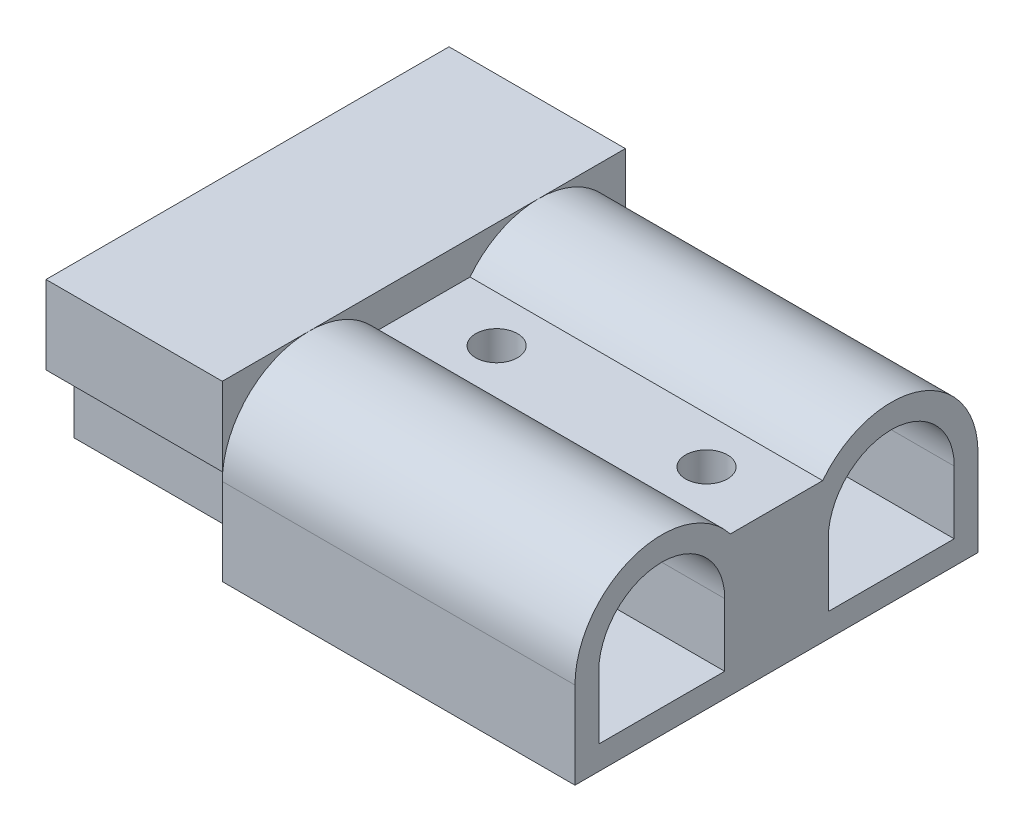
ISO-10303-21;
HEADER;
FILE_DESCRIPTION(('STEP AP214'),'2;1');
FILE_NAME('part.step','',(''),(''),'','','');
FILE_SCHEMA(('AUTOMOTIVE_DESIGN { 1 0 10303 214 1 1 1 1 }'));
ENDSEC;
DATA;
#1=APPLICATION_CONTEXT('core data for automotive mechanical design processes');
#2=APPLICATION_PROTOCOL_DEFINITION('international standard','automotive_design',2000,#1);
#3=PRODUCT_CONTEXT('',#1,'mechanical');
#4=PRODUCT('Part','Part','',(#3));
#5=PRODUCT_RELATED_PRODUCT_CATEGORY('part','',(#4));
#6=PRODUCT_DEFINITION_FORMATION('','',#4);
#7=PRODUCT_DEFINITION_CONTEXT('part definition',#1,'design');
#8=PRODUCT_DEFINITION('design','',#6,#7);
#9=PRODUCT_DEFINITION_SHAPE('','',#8);
#10=(LENGTH_UNIT() NAMED_UNIT(*) SI_UNIT(.MILLI.,.METRE.));
#11=(NAMED_UNIT(*) PLANE_ANGLE_UNIT() SI_UNIT($,.RADIAN.));
#12=(NAMED_UNIT(*) SI_UNIT($,.STERADIAN.) SOLID_ANGLE_UNIT());
#13=UNCERTAINTY_MEASURE_WITH_UNIT(LENGTH_MEASURE(1.E-05),#10,'distance_accuracy_value','');
#14=(GEOMETRIC_REPRESENTATION_CONTEXT(3) GLOBAL_UNCERTAINTY_ASSIGNED_CONTEXT((#13)) GLOBAL_UNIT_ASSIGNED_CONTEXT((#10,
#11,#12)) REPRESENTATION_CONTEXT('',''));
#15=CARTESIAN_POINT('',(0.,0.,0.));
#16=DIRECTION('',(0.,0.,1.));
#17=DIRECTION('',(1.,0.,0.));
#18=AXIS2_PLACEMENT_3D('',#15,#16,#17);
#19=CARTESIAN_POINT('',(0.,-5.842,-18.288));
#20=DIRECTION('',(0.,-1.,0.));
#21=DIRECTION('',(0.,0.,-1.));
#22=AXIS2_PLACEMENT_3D('',#19,#20,#21);
#23=PLANE('',#22);
#24=DIRECTION('',(1.,0.,0.));
#25=VECTOR('',#24,1.);
#26=CARTESIAN_POINT('',(-16.002,-5.842,-1.27));
#27=LINE('',#26,#25);
#28=CARTESIAN_POINT('',(-16.002,-5.842,-1.27));
#29=VERTEX_POINT('',#28);
#30=CARTESIAN_POINT('',(0.,-5.842,-1.27));
#31=VERTEX_POINT('',#30);
#32=EDGE_CURVE('E50',#29,#31,#27,.T.);
#33=ORIENTED_EDGE('',*,*,#32,.F.);
#34=DIRECTION('',(0.,0.,-1.));
#35=VECTOR('',#34,1.);
#36=CARTESIAN_POINT('',(-16.002,-5.842,-18.288));
#37=LINE('',#36,#35);
#38=CARTESIAN_POINT('',(-16.002,-5.842,-15.748));
#39=VERTEX_POINT('',#38);
#40=EDGE_CURVE('E315',#29,#39,#37,.T.);
#41=ORIENTED_EDGE('',*,*,#40,.T.);
#42=DIRECTION('',(-1.,0.,0.));
#43=VECTOR('',#42,1.);
#44=CARTESIAN_POINT('',(0.,-5.842,-15.748));
#45=LINE('',#44,#43);
#46=CARTESIAN_POINT('',(0.,-5.842,-15.748));
#47=VERTEX_POINT('',#46);
#48=EDGE_CURVE('E289',#47,#39,#45,.T.);
#49=ORIENTED_EDGE('',*,*,#48,.F.);
#50=DIRECTION('',(0.,0.,-1.));
#51=VECTOR('',#50,1.);
#52=CARTESIAN_POINT('',(0.,-5.842,-18.288));
#53=LINE('',#52,#51);
#54=EDGE_CURVE('E38',#31,#47,#53,.T.);
#55=ORIENTED_EDGE('',*,*,#54,.F.);
#56=EDGE_LOOP('',(#33,#41,#49,#55));
#57=FACE_BOUND('',#56,.T.);
#58=ADVANCED_FACE('F34',(#57),#23,.T.);
#59=CARTESIAN_POINT('',(0.,0.762000000000001,18.288));
#60=DIRECTION('',(1.,0.,0.));
#61=DIRECTION('',(0.,0.,-1.));
#62=AXIS2_PLACEMENT_3D('',#59,#60,#61);
#63=PLANE('',#62);
#64=DIRECTION('',(0.,0.,-1.));
#65=VECTOR('',#64,1.);
#66=CARTESIAN_POINT('',(0.,0.762000000000002,-15.748));
#67=LINE('',#66,#65);
#68=CARTESIAN_POINT('',(0.,0.762000000000002,-15.748));
#69=VERTEX_POINT('',#68);
#70=CARTESIAN_POINT('',(0.,0.762000000000002,-16.0779721927284));
#71=VERTEX_POINT('',#70);
#72=EDGE_CURVE('E316',#69,#71,#67,.T.);
#73=ORIENTED_EDGE('',*,*,#72,.T.);
#74=CARTESIAN_POINT('',(0.,0.,-10.414));
#75=DIRECTION('',(1.,0.,0.));
#76=DIRECTION('',(0.,0.,-1.));
#77=AXIS2_PLACEMENT_3D('',#74,#75,#76);
#78=CIRCLE('',#77,5.71500000000002);
#79=CARTESIAN_POINT('',(0.,0.,-4.69900000000002));
#80=VERTEX_POINT('',#79);
#81=EDGE_CURVE('E430',#71,#80,#78,.T.);
#82=ORIENTED_EDGE('',*,*,#81,.T.);
#83=DIRECTION('',(0.,-1.,0.));
#84=VECTOR('',#83,1.);
#85=CARTESIAN_POINT('',(0.,0.,-4.69900000000002));
#86=LINE('',#85,#84);
#87=CARTESIAN_POINT('',(0.,-5.71499999999999,-4.69900000000004));
#88=VERTEX_POINT('',#87);
#89=EDGE_CURVE('E423',#80,#88,#86,.T.);
#90=ORIENTED_EDGE('',*,*,#89,.T.);
#91=DIRECTION('',(0.,0.,-1.));
#92=VECTOR('',#91,1.);
#93=CARTESIAN_POINT('',(0.,-5.71499999999999,-4.69900000000004));
#94=LINE('',#93,#92);
#95=CARTESIAN_POINT('',(0.,-5.71499999999999,-15.748));
#96=VERTEX_POINT('',#95);
#97=EDGE_CURVE('E419',#88,#96,#94,.T.);
#98=ORIENTED_EDGE('',*,*,#97,.T.);
#99=DIRECTION('',(0.,-1.,0.));
#100=VECTOR('',#99,1.);
#101=CARTESIAN_POINT('',(0.,0.762000000000002,-15.748));
#102=LINE('',#101,#100);
#103=EDGE_CURVE('E293',#69,#96,#102,.T.);
#104=ORIENTED_EDGE('',*,*,#103,.F.);
#105=EDGE_LOOP('',(#73,#82,#90,#98,#104));
#106=FACE_BOUND('',#105,.T.);
#107=ADVANCED_FACE('F585',(#106),#63,.T.);
#108=CARTESIAN_POINT('',(0.,0.,10.414));
#109=DIRECTION('',(1.,0.,0.));
#110=DIRECTION('',(0.,0.,1.));
#111=AXIS2_PLACEMENT_3D('',#108,#109,#110);
#112=CIRCLE('',#111,7.87399999999999);
#113=CARTESIAN_POINT('',(0.,7.874,10.414));
#114=VERTEX_POINT('',#113);
#115=CARTESIAN_POINT('',(0.,0.762000000000001,18.2510422992351));
#116=VERTEX_POINT('',#115);
#117=EDGE_CURVE('E385',#114,#116,#112,.T.);
#118=ORIENTED_EDGE('',*,*,#117,.F.);
#119=DIRECTION('',(0.,0.,-1.));
#120=VECTOR('',#119,1.);
#121=CARTESIAN_POINT('',(0.,7.874,18.288));
#122=LINE('',#121,#120);
#123=CARTESIAN_POINT('',(0.,7.874,18.288));
#124=VERTEX_POINT('',#123);
#125=EDGE_CURVE('E327',#124,#114,#122,.T.);
#126=ORIENTED_EDGE('',*,*,#125,.F.);
#127=DIRECTION('',(0.,1.,0.));
#128=VECTOR('',#127,1.);
#129=CARTESIAN_POINT('',(0.,0.762000000000001,18.288));
#130=LINE('',#129,#128);
#131=CARTESIAN_POINT('',(0.,0.762000000000001,18.288));
#132=VERTEX_POINT('',#131);
#133=EDGE_CURVE('E337',#132,#124,#130,.T.);
#134=ORIENTED_EDGE('',*,*,#133,.F.);
#135=DIRECTION('',(0.,0.,1.));
#136=VECTOR('',#135,1.);
#137=CARTESIAN_POINT('',(0.,0.762000000000001,15.748));
#138=LINE('',#137,#136);
#139=EDGE_CURVE('E363',#116,#132,#138,.T.);
#140=ORIENTED_EDGE('',*,*,#139,.F.);
#141=EDGE_LOOP('',(#118,#126,#134,#140));
#142=FACE_BOUND('',#141,.T.);
#143=ADVANCED_FACE('F537',(#142),#63,.T.);
#144=CARTESIAN_POINT('',(0.,4.826,4.19229605333077));
#145=VERTEX_POINT('',#144);
#146=EDGE_CURVE('E382',#145,#114,#112,.T.);
#147=ORIENTED_EDGE('',*,*,#146,.F.);
#148=DIRECTION('',(0.,0.,1.));
#149=VECTOR('',#148,1.);
#150=CARTESIAN_POINT('',(0.,4.826,4.19229605333077));
#151=LINE('',#150,#149);
#152=CARTESIAN_POINT('',(0.,4.82600000000001,-4.19229605333076));
#153=VERTEX_POINT('',#152);
#154=EDGE_CURVE('E386',#153,#145,#151,.T.);
#155=ORIENTED_EDGE('',*,*,#154,.F.);
#156=CARTESIAN_POINT('',(0.,0.,-10.414));
#157=DIRECTION('',(1.,0.,0.));
#158=DIRECTION('',(0.,0.,1.));
#159=AXIS2_PLACEMENT_3D('',#156,#157,#158);
#160=CIRCLE('',#159,7.87399999999999);
#161=CARTESIAN_POINT('',(0.,7.874,-10.414));
#162=VERTEX_POINT('',#161);
#163=EDGE_CURVE('E393',#162,#153,#160,.T.);
#164=ORIENTED_EDGE('',*,*,#163,.F.);
#165=EDGE_CURVE('E331',#114,#162,#122,.T.);
#166=ORIENTED_EDGE('',*,*,#165,.F.);
#167=EDGE_LOOP('',(#147,#155,#164,#166));
#168=FACE_BOUND('',#167,.T.);
#169=ADVANCED_FACE('F528',(#168),#63,.T.);
#170=DIRECTION('',(0.,1.,0.));
#171=VECTOR('',#170,1.);
#172=CARTESIAN_POINT('',(0.,-5.71499999999999,4.69899999999999));
#173=LINE('',#172,#171);
#174=CARTESIAN_POINT('',(0.,-5.71499999999999,4.69899999999999));
#175=VERTEX_POINT('',#174);
#176=CARTESIAN_POINT('',(0.,0.,4.69899999999999));
#177=VERTEX_POINT('',#176);
#178=EDGE_CURVE('E58',#175,#177,#173,.T.);
#179=ORIENTED_EDGE('',*,*,#178,.T.);
#180=CARTESIAN_POINT('',(0.,0.,10.414));
#181=DIRECTION('',(1.,0.,0.));
#182=DIRECTION('',(0.,0.,-1.));
#183=AXIS2_PLACEMENT_3D('',#180,#181,#182);
#184=CIRCLE('',#183,5.71500000000003);
#185=CARTESIAN_POINT('',(0.,0.762000000000002,16.0779721927284));
#186=VERTEX_POINT('',#185);
#187=EDGE_CURVE('E454',#177,#186,#184,.T.);
#188=ORIENTED_EDGE('',*,*,#187,.T.);
#189=CARTESIAN_POINT('',(0.,0.762000000000001,15.748));
#190=VERTEX_POINT('',#189);
#191=EDGE_CURVE('E359',#190,#186,#138,.T.);
#192=ORIENTED_EDGE('',*,*,#191,.F.);
#193=DIRECTION('',(0.,-1.,0.));
#194=VECTOR('',#193,1.);
#195=CARTESIAN_POINT('',(0.,0.762000000000001,15.748));
#196=LINE('',#195,#194);
#197=CARTESIAN_POINT('',(0.,-5.71499999999999,15.748));
#198=VERTEX_POINT('',#197);
#199=EDGE_CURVE('E348',#190,#198,#196,.T.);
#200=ORIENTED_EDGE('',*,*,#199,.T.);
#201=DIRECTION('',(0.,0.,-1.));
#202=VECTOR('',#201,1.);
#203=CARTESIAN_POINT('',(0.,-5.71499999999999,16.129));
#204=LINE('',#203,#202);
#205=EDGE_CURVE('E340',#198,#175,#204,.T.);
#206=ORIENTED_EDGE('',*,*,#205,.T.);
#207=EDGE_LOOP('',(#179,#188,#192,#200,#206));
#208=FACE_BOUND('',#207,.T.);
#209=ADVANCED_FACE('F484',(#208),#63,.T.);
#210=CARTESIAN_POINT('',(-16.002,0.762000000000001,18.288));
#211=DIRECTION('',(0.,0.,1.));
#212=DIRECTION('',(1.,0.,0.));
#213=AXIS2_PLACEMENT_3D('',#210,#211,#212);
#214=PLANE('',#213);
#215=DIRECTION('',(0.,1.,0.));
#216=VECTOR('',#215,1.);
#217=CARTESIAN_POINT('',(-16.002,0.762000000000001,18.288));
#218=LINE('',#217,#216);
#219=CARTESIAN_POINT('',(-16.002,0.762000000000002,18.288));
#220=VERTEX_POINT('',#219);
#221=CARTESIAN_POINT('',(-16.002,7.874,18.288));
#222=VERTEX_POINT('',#221);
#223=EDGE_CURVE('E338',#220,#222,#218,.T.);
#224=ORIENTED_EDGE('',*,*,#223,.F.);
#225=DIRECTION('',(-1.,0.,0.));
#226=VECTOR('',#225,1.);
#227=CARTESIAN_POINT('',(0.,0.762000000000001,18.288));
#228=LINE('',#227,#226);
#229=EDGE_CURVE('E357',#132,#220,#228,.T.);
#230=ORIENTED_EDGE('',*,*,#229,.F.);
#231=ORIENTED_EDGE('',*,*,#133,.T.);
#232=DIRECTION('',(1.,0.,0.));
#233=VECTOR('',#232,1.);
#234=CARTESIAN_POINT('',(-16.002,7.874,18.288));
#235=LINE('',#234,#233);
#236=EDGE_CURVE('E323',#222,#124,#235,.T.);
#237=ORIENTED_EDGE('',*,*,#236,.F.);
#238=EDGE_LOOP('',(#224,#230,#231,#237));
#239=FACE_BOUND('',#238,.T.);
#240=ADVANCED_FACE('F36',(#239),#214,.T.);
#241=DIRECTION('',(-1.,0.,0.));
#242=VECTOR('',#241,1.);
#243=CARTESIAN_POINT('',(0.,-5.842,1.27));
#244=LINE('',#243,#242);
#245=CARTESIAN_POINT('',(0.,-5.842,1.27));
#246=VERTEX_POINT('',#245);
#247=CARTESIAN_POINT('',(-16.002,-5.842,1.27));
#248=VERTEX_POINT('',#247);
#249=EDGE_CURVE('E255',#246,#248,#244,.T.);
#250=ORIENTED_EDGE('',*,*,#249,.F.);
#251=CARTESIAN_POINT('',(0.,-5.842,15.748));
#252=VERTEX_POINT('',#251);
#253=EDGE_CURVE('E11',#252,#246,#53,.T.);
#254=ORIENTED_EDGE('',*,*,#253,.F.);
#255=DIRECTION('',(1.,0.,0.));
#256=VECTOR('',#255,1.);
#257=CARTESIAN_POINT('',(-16.002,-5.842,15.748));
#258=LINE('',#257,#256);
#259=CARTESIAN_POINT('',(-16.002,-5.842,15.748));
#260=VERTEX_POINT('',#259);
#261=EDGE_CURVE('E350',#260,#252,#258,.T.);
#262=ORIENTED_EDGE('',*,*,#261,.F.);
#263=EDGE_CURVE('E320',#260,#248,#37,.T.);
#264=ORIENTED_EDGE('',*,*,#263,.T.);
#265=EDGE_LOOP('',(#250,#254,#262,#264));
#266=FACE_BOUND('',#265,.T.);
#267=ADVANCED_FACE('F549',(#266),#23,.T.);
#268=CARTESIAN_POINT('',(-16.002,0.762000000000001,-18.288));
#269=DIRECTION('',(-1.,0.,0.));
#270=DIRECTION('',(0.,0.,1.));
#271=AXIS2_PLACEMENT_3D('',#268,#269,#270);
#272=PLANE('',#271);
#273=DIRECTION('',(0.,-1.,0.));
#274=VECTOR('',#273,1.);
#275=CARTESIAN_POINT('',(-16.002,0.762000000000003,-1.27));
#276=LINE('',#275,#274);
#277=CARTESIAN_POINT('',(-16.002,0.762000000000003,-1.27));
#278=VERTEX_POINT('',#277);
#279=EDGE_CURVE('E267',#278,#29,#276,.T.);
#280=ORIENTED_EDGE('',*,*,#279,.F.);
#281=DIRECTION('',(0.,0.,-1.));
#282=VECTOR('',#281,1.);
#283=CARTESIAN_POINT('',(-16.002,0.762000000000003,1.27));
#284=LINE('',#283,#282);
#285=CARTESIAN_POINT('',(-16.002,0.762000000000003,1.27));
#286=VERTEX_POINT('',#285);
#287=EDGE_CURVE('E250',#286,#278,#284,.T.);
#288=ORIENTED_EDGE('',*,*,#287,.F.);
#289=DIRECTION('',(0.,-1.,0.));
#290=VECTOR('',#289,1.);
#291=CARTESIAN_POINT('',(-16.002,0.762000000000003,1.27));
#292=LINE('',#291,#290);
#293=EDGE_CURVE('E241',#286,#248,#292,.T.);
#294=ORIENTED_EDGE('',*,*,#293,.T.);
#295=ORIENTED_EDGE('',*,*,#263,.F.);
#296=DIRECTION('',(0.,-1.,0.));
#297=VECTOR('',#296,1.);
#298=CARTESIAN_POINT('',(-16.002,0.762000000000002,15.748));
#299=LINE('',#298,#297);
#300=CARTESIAN_POINT('',(-16.002,0.762000000000002,15.748));
#301=VERTEX_POINT('',#300);
#302=EDGE_CURVE('E312',#301,#260,#299,.T.);
#303=ORIENTED_EDGE('',*,*,#302,.F.);
#304=DIRECTION('',(0.,0.,-1.));
#305=VECTOR('',#304,1.);
#306=CARTESIAN_POINT('',(-16.002,0.762000000000002,18.288));
#307=LINE('',#306,#305);
#308=EDGE_CURVE('E349',#220,#301,#307,.T.);
#309=ORIENTED_EDGE('',*,*,#308,.F.);
#310=ORIENTED_EDGE('',*,*,#223,.T.);
#311=DIRECTION('',(0.,0.,1.));
#312=VECTOR('',#311,1.);
#313=CARTESIAN_POINT('',(-16.002,7.874,-18.288));
#314=LINE('',#313,#312);
#315=CARTESIAN_POINT('',(-16.002,7.874,-18.288));
#316=VERTEX_POINT('',#315);
#317=EDGE_CURVE('E334',#316,#222,#314,.T.);
#318=ORIENTED_EDGE('',*,*,#317,.F.);
#319=DIRECTION('',(0.,1.,0.));
#320=VECTOR('',#319,1.);
#321=CARTESIAN_POINT('',(-16.002,0.762000000000001,-18.288));
#322=LINE('',#321,#320);
#323=CARTESIAN_POINT('',(-16.002,0.762000000000002,-18.288));
#324=VERTEX_POINT('',#323);
#325=EDGE_CURVE('E341',#324,#316,#322,.T.);
#326=ORIENTED_EDGE('',*,*,#325,.F.);
#327=DIRECTION('',(0.,0.,-1.));
#328=VECTOR('',#327,1.);
#329=CARTESIAN_POINT('',(-16.002,0.762000000000002,-15.748));
#330=LINE('',#329,#328);
#331=CARTESIAN_POINT('',(-16.002,0.762000000000002,-15.748));
#332=VERTEX_POINT('',#331);
#333=EDGE_CURVE('E313',#332,#324,#330,.T.);
#334=ORIENTED_EDGE('',*,*,#333,.F.);
#335=DIRECTION('',(0.,1.,0.));
#336=VECTOR('',#335,1.);
#337=CARTESIAN_POINT('',(-16.002,-5.842,-15.748));
#338=LINE('',#337,#336);
#339=EDGE_CURVE('E292',#39,#332,#338,.T.);
#340=ORIENTED_EDGE('',*,*,#339,.F.);
#341=ORIENTED_EDGE('',*,*,#40,.F.);
#342=EDGE_LOOP('',(#280,#288,#294,#295,#303,#309,#310,#318,#326,#334,#340,#341));
#343=FACE_BOUND('',#342,.T.);
#344=ADVANCED_FACE('F544',(#343),#272,.T.);
#345=CARTESIAN_POINT('',(0.,0.762000000000001,-18.288));
#346=DIRECTION('',(0.,0.,-1.));
#347=DIRECTION('',(-1.,0.,0.));
#348=AXIS2_PLACEMENT_3D('',#345,#346,#347);
#349=PLANE('',#348);
#350=DIRECTION('',(1.,0.,0.));
#351=VECTOR('',#350,1.);
#352=CARTESIAN_POINT('',(-16.002,0.762000000000002,-18.288));
#353=LINE('',#352,#351);
#354=CARTESIAN_POINT('',(0.,0.762000000000002,-18.288));
#355=VERTEX_POINT('',#354);
#356=EDGE_CURVE('E309',#324,#355,#353,.T.);
#357=ORIENTED_EDGE('',*,*,#356,.F.);
#358=ORIENTED_EDGE('',*,*,#325,.T.);
#359=DIRECTION('',(-1.,0.,0.));
#360=VECTOR('',#359,1.);
#361=CARTESIAN_POINT('',(0.,7.874,-18.288));
#362=LINE('',#361,#360);
#363=CARTESIAN_POINT('',(0.,7.874,-18.288));
#364=VERTEX_POINT('',#363);
#365=EDGE_CURVE('E330',#364,#316,#362,.T.);
#366=ORIENTED_EDGE('',*,*,#365,.F.);
#367=DIRECTION('',(0.,1.,0.));
#368=VECTOR('',#367,1.);
#369=CARTESIAN_POINT('',(0.,0.762000000000001,-18.288));
#370=LINE('',#369,#368);
#371=EDGE_CURVE('E343',#355,#364,#370,.T.);
#372=ORIENTED_EDGE('',*,*,#371,.F.);
#373=EDGE_LOOP('',(#357,#358,#366,#372));
#374=FACE_BOUND('',#373,.T.);
#375=ADVANCED_FACE('F566',(#374),#349,.T.);
#376=CARTESIAN_POINT('',(0.,0.762000000000002,-18.2510422992351));
#377=VERTEX_POINT('',#376);
#378=EDGE_CURVE('E392',#377,#162,#160,.T.);
#379=ORIENTED_EDGE('',*,*,#378,.F.);
#380=EDGE_CURVE('E308',#377,#355,#67,.T.);
#381=ORIENTED_EDGE('',*,*,#380,.T.);
#382=ORIENTED_EDGE('',*,*,#371,.T.);
#383=EDGE_CURVE('E326',#162,#364,#122,.T.);
#384=ORIENTED_EDGE('',*,*,#383,.F.);
#385=EDGE_LOOP('',(#379,#381,#382,#384));
#386=FACE_BOUND('',#385,.T.);
#387=ADVANCED_FACE('F569',(#386),#63,.T.);
#388=CARTESIAN_POINT('',(0.,7.874,0.));
#389=DIRECTION('',(0.,1.,0.));
#390=DIRECTION('',(0.,0.,1.));
#391=AXIS2_PLACEMENT_3D('',#388,#389,#390);
#392=PLANE('',#391);
#393=ORIENTED_EDGE('',*,*,#236,.T.);
#394=ORIENTED_EDGE('',*,*,#125,.T.);
#395=ORIENTED_EDGE('',*,*,#165,.T.);
#396=ORIENTED_EDGE('',*,*,#383,.T.);
#397=ORIENTED_EDGE('',*,*,#365,.T.);
#398=ORIENTED_EDGE('',*,*,#317,.T.);
#399=EDGE_LOOP('',(#393,#394,#395,#396,#397,#398));
#400=FACE_BOUND('',#399,.T.);
#401=ADVANCED_FACE('F533',(#400),#392,.T.);
#402=CARTESIAN_POINT('',(-16.002,0.762000000000002,-15.748));
#403=DIRECTION('',(0.,1.,0.));
#404=DIRECTION('',(0.,0.,1.));
#405=AXIS2_PLACEMENT_3D('',#402,#403,#404);
#406=PLANE('',#405);
#407=ORIENTED_EDGE('',*,*,#356,.T.);
#408=ORIENTED_EDGE('',*,*,#380,.F.);
#409=EDGE_CURVE('E319',#71,#377,#67,.T.);
#410=ORIENTED_EDGE('',*,*,#409,.F.);
#411=ORIENTED_EDGE('',*,*,#72,.F.);
#412=DIRECTION('',(1.,0.,0.));
#413=VECTOR('',#412,1.);
#414=CARTESIAN_POINT('',(-16.002,0.762000000000002,-15.748));
#415=LINE('',#414,#413);
#416=EDGE_CURVE('E298',#332,#69,#415,.T.);
#417=ORIENTED_EDGE('',*,*,#416,.F.);
#418=ORIENTED_EDGE('',*,*,#333,.T.);
#419=EDGE_LOOP('',(#407,#408,#410,#411,#417,#418));
#420=FACE_BOUND('',#419,.T.);
#421=ADVANCED_FACE('F562',(#420),#406,.F.);
#422=CARTESIAN_POINT('',(0.,0.,-15.748));
#423=DIRECTION('',(0.,0.,-1.));
#424=DIRECTION('',(-1.,0.,0.));
#425=AXIS2_PLACEMENT_3D('',#422,#423,#424);
#426=PLANE('',#425);
#427=ORIENTED_EDGE('',*,*,#416,.T.);
#428=ORIENTED_EDGE('',*,*,#103,.T.);
#429=EDGE_CURVE('E294',#96,#47,#102,.T.);
#430=ORIENTED_EDGE('',*,*,#429,.T.);
#431=ORIENTED_EDGE('',*,*,#48,.T.);
#432=ORIENTED_EDGE('',*,*,#339,.T.);
#433=EDGE_LOOP('',(#427,#428,#430,#431,#432));
#434=FACE_BOUND('',#433,.T.);
#435=ADVANCED_FACE('F558',(#434),#426,.T.);
#436=CARTESIAN_POINT('',(-16.002,0.762000000000002,15.748));
#437=DIRECTION('',(0.,0.,-1.));
#438=DIRECTION('',(-1.,0.,0.));
#439=AXIS2_PLACEMENT_3D('',#436,#437,#438);
#440=PLANE('',#439);
#441=ORIENTED_EDGE('',*,*,#261,.T.);
#442=EDGE_CURVE('E347',#198,#252,#196,.T.);
#443=ORIENTED_EDGE('',*,*,#442,.F.);
#444=ORIENTED_EDGE('',*,*,#199,.F.);
#445=DIRECTION('',(1.,0.,0.));
#446=VECTOR('',#445,1.);
#447=CARTESIAN_POINT('',(-16.002,0.762000000000002,15.748));
#448=LINE('',#447,#446);
#449=EDGE_CURVE('E364',#301,#190,#448,.T.);
#450=ORIENTED_EDGE('',*,*,#449,.F.);
#451=ORIENTED_EDGE('',*,*,#302,.T.);
#452=EDGE_LOOP('',(#441,#443,#444,#450,#451));
#453=FACE_BOUND('',#452,.T.);
#454=ADVANCED_FACE('F492',(#453),#440,.F.);
#455=CARTESIAN_POINT('',(0.,0.762000000000001,0.));
#456=DIRECTION('',(0.,-1.,0.));
#457=DIRECTION('',(1.,0.,0.));
#458=AXIS2_PLACEMENT_3D('',#455,#456,#457);
#459=PLANE('',#458);
#460=ORIENTED_EDGE('',*,*,#449,.T.);
#461=ORIENTED_EDGE('',*,*,#191,.T.);
#462=EDGE_CURVE('E362',#186,#116,#138,.T.);
#463=ORIENTED_EDGE('',*,*,#462,.T.);
#464=ORIENTED_EDGE('',*,*,#139,.T.);
#465=ORIENTED_EDGE('',*,*,#229,.T.);
#466=ORIENTED_EDGE('',*,*,#308,.T.);
#467=EDGE_LOOP('',(#460,#461,#463,#464,#465,#466));
#468=FACE_BOUND('',#467,.T.);
#469=ADVANCED_FACE('F486',(#468),#459,.T.);
#470=CARTESIAN_POINT('',(0.,0.,10.414));
#471=DIRECTION('',(-1.,0.,0.));
#472=DIRECTION('',(0.,0.,1.));
#473=AXIS2_PLACEMENT_3D('',#470,#471,#472);
#474=PLANE('',#473);
#475=ORIENTED_EDGE('',*,*,#429,.F.);
#476=CARTESIAN_POINT('',(0.,-5.71499999999999,-16.1290000000001));
#477=VERTEX_POINT('',#476);
#478=EDGE_CURVE('E422',#96,#477,#94,.T.);
#479=ORIENTED_EDGE('',*,*,#478,.T.);
#480=DIRECTION('',(0.,1.,0.));
#481=VECTOR('',#480,1.);
#482=CARTESIAN_POINT('',(0.,-5.71499999999999,-16.1290000000001));
#483=LINE('',#482,#481);
#484=CARTESIAN_POINT('',(0.,0.,-16.1290000000001));
#485=VERTEX_POINT('',#484);
#486=EDGE_CURVE('E415',#477,#485,#483,.T.);
#487=ORIENTED_EDGE('',*,*,#486,.T.);
#488=EDGE_CURVE('E426',#485,#71,#78,.T.);
#489=ORIENTED_EDGE('',*,*,#488,.T.);
#490=ORIENTED_EDGE('',*,*,#409,.T.);
#491=CARTESIAN_POINT('',(0.,0.,-18.288));
#492=VERTEX_POINT('',#491);
#493=EDGE_CURVE('E388',#492,#377,#160,.T.);
#494=ORIENTED_EDGE('',*,*,#493,.F.);
#495=DIRECTION('',(0.,1.,0.));
#496=VECTOR('',#495,1.);
#497=CARTESIAN_POINT('',(0.,0.,-18.288));
#498=LINE('',#497,#496);
#499=CARTESIAN_POINT('',(0.,-7.87399999999999,-18.288));
#500=VERTEX_POINT('',#499);
#501=EDGE_CURVE('E391',#500,#492,#498,.T.);
#502=ORIENTED_EDGE('',*,*,#501,.F.);
#503=DIRECTION('',(0.,0.,-1.));
#504=VECTOR('',#503,1.);
#505=CARTESIAN_POINT('',(0.,-7.87399999999999,-18.288));
#506=LINE('',#505,#504);
#507=CARTESIAN_POINT('',(0.,-7.87399999999999,18.288));
#508=VERTEX_POINT('',#507);
#509=EDGE_CURVE('E275',#508,#500,#506,.T.);
#510=ORIENTED_EDGE('',*,*,#509,.F.);
#511=DIRECTION('',(0.,-1.,0.));
#512=VECTOR('',#511,1.);
#513=CARTESIAN_POINT('',(0.,-5.842,18.288));
#514=LINE('',#513,#512);
#515=CARTESIAN_POINT('',(0.,0.,18.288));
#516=VERTEX_POINT('',#515);
#517=EDGE_CURVE('E379',#516,#508,#514,.T.);
#518=ORIENTED_EDGE('',*,*,#517,.F.);
#519=EDGE_CURVE('E384',#116,#516,#112,.T.);
#520=ORIENTED_EDGE('',*,*,#519,.F.);
#521=ORIENTED_EDGE('',*,*,#462,.F.);
#522=CARTESIAN_POINT('',(0.,0.,16.129));
#523=VERTEX_POINT('',#522);
#524=EDGE_CURVE('E280',#186,#523,#184,.T.);
#525=ORIENTED_EDGE('',*,*,#524,.T.);
#526=DIRECTION('',(0.,-1.,0.));
#527=VECTOR('',#526,1.);
#528=CARTESIAN_POINT('',(0.,0.,16.129));
#529=LINE('',#528,#527);
#530=CARTESIAN_POINT('',(0.,-5.71499999999999,16.129));
#531=VERTEX_POINT('',#530);
#532=EDGE_CURVE('E451',#523,#531,#529,.T.);
#533=ORIENTED_EDGE('',*,*,#532,.T.);
#534=EDGE_CURVE('E448',#531,#198,#204,.T.);
#535=ORIENTED_EDGE('',*,*,#534,.T.);
#536=ORIENTED_EDGE('',*,*,#442,.T.);
#537=ORIENTED_EDGE('',*,*,#253,.T.);
#538=DIRECTION('',(0.,-1.,0.));
#539=VECTOR('',#538,1.);
#540=CARTESIAN_POINT('',(0.,0.762000000000002,1.27));
#541=LINE('',#540,#539);
#542=CARTESIAN_POINT('',(0.,0.762000000000002,1.27));
#543=VERTEX_POINT('',#542);
#544=EDGE_CURVE('E232',#543,#246,#541,.T.);
#545=ORIENTED_EDGE('',*,*,#544,.F.);
#546=DIRECTION('',(0.,0.,1.));
#547=VECTOR('',#546,1.);
#548=CARTESIAN_POINT('',(0.,0.762000000000002,-1.27));
#549=LINE('',#548,#547);
#550=CARTESIAN_POINT('',(0.,0.762000000000002,-1.27));
#551=VERTEX_POINT('',#550);
#552=EDGE_CURVE('E236',#551,#543,#549,.T.);
#553=ORIENTED_EDGE('',*,*,#552,.F.);
#554=DIRECTION('',(0.,-1.,0.));
#555=VECTOR('',#554,1.);
#556=CARTESIAN_POINT('',(0.,0.762000000000002,-1.27));
#557=LINE('',#556,#555);
#558=EDGE_CURVE('E264',#551,#31,#557,.T.);
#559=ORIENTED_EDGE('',*,*,#558,.T.);
#560=ORIENTED_EDGE('',*,*,#54,.T.);
#561=EDGE_LOOP('',(#475,#479,#487,#489,#490,#494,#502,#510,#518,#520,#521,#525,#533,#535,#536,
#537,#545,#553,#559,#560));
#562=FACE_BOUND('',#561,.T.);
#563=ADVANCED_FACE('F234',(#562),#474,.T.);
#564=CARTESIAN_POINT('',(32.004,0.,10.414));
#565=DIRECTION('',(-1.,0.,0.));
#566=DIRECTION('',(0.,0.,1.));
#567=AXIS2_PLACEMENT_3D('',#564,#565,#566);
#568=PLANE('',#567);
#569=CARTESIAN_POINT('',(32.004,0.,-10.414));
#570=DIRECTION('',(1.,0.,0.));
#571=DIRECTION('',(0.,0.,-1.));
#572=AXIS2_PLACEMENT_3D('',#569,#570,#571);
#573=CIRCLE('',#572,5.71500000000002);
#574=CARTESIAN_POINT('',(32.004,0.,-16.1290000000001));
#575=VERTEX_POINT('',#574);
#576=CARTESIAN_POINT('',(32.004,0.,-4.69900000000002));
#577=VERTEX_POINT('',#576);
#578=EDGE_CURVE('E418',#575,#577,#573,.T.);
#579=ORIENTED_EDGE('',*,*,#578,.F.);
#580=DIRECTION('',(0.,1.,0.));
#581=VECTOR('',#580,1.);
#582=CARTESIAN_POINT('',(32.004,-5.71499999999999,-16.1290000000001));
#583=LINE('',#582,#581);
#584=CARTESIAN_POINT('',(32.004,-5.71499999999999,-16.1290000000001));
#585=VERTEX_POINT('',#584);
#586=EDGE_CURVE('E414',#585,#575,#583,.T.);
#587=ORIENTED_EDGE('',*,*,#586,.F.);
#588=DIRECTION('',(0.,0.,-1.));
#589=VECTOR('',#588,1.);
#590=CARTESIAN_POINT('',(32.004,-5.71499999999999,-4.69900000000004));
#591=LINE('',#590,#589);
#592=CARTESIAN_POINT('',(32.004,-5.71499999999999,-4.69900000000004));
#593=VERTEX_POINT('',#592);
#594=EDGE_CURVE('E432',#593,#585,#591,.T.);
#595=ORIENTED_EDGE('',*,*,#594,.F.);
#596=DIRECTION('',(0.,-1.,0.));
#597=VECTOR('',#596,1.);
#598=CARTESIAN_POINT('',(32.004,0.,-4.69900000000002));
#599=LINE('',#598,#597);
#600=EDGE_CURVE('E435',#577,#593,#599,.T.);
#601=ORIENTED_EDGE('',*,*,#600,.F.);
#602=EDGE_LOOP('',(#579,#587,#595,#601));
#603=FACE_BOUND('',#602,.T.);
#604=DIRECTION('',(0.,-1.,0.));
#605=VECTOR('',#604,1.);
#606=CARTESIAN_POINT('',(32.004,-5.842,18.288));
#607=LINE('',#606,#605);
#608=CARTESIAN_POINT('',(32.004,0.,18.288));
#609=VERTEX_POINT('',#608);
#610=CARTESIAN_POINT('',(32.004,-7.87399999999999,18.288));
#611=VERTEX_POINT('',#610);
#612=EDGE_CURVE('E378',#609,#611,#607,.T.);
#613=ORIENTED_EDGE('',*,*,#612,.T.);
#614=DIRECTION('',(0.,0.,1.));
#615=VECTOR('',#614,1.);
#616=CARTESIAN_POINT('',(32.004,-7.87399999999999,18.288));
#617=LINE('',#616,#615);
#618=CARTESIAN_POINT('',(32.004,-7.87399999999999,-18.288));
#619=VERTEX_POINT('',#618);
#620=EDGE_CURVE('E266',#619,#611,#617,.T.);
#621=ORIENTED_EDGE('',*,*,#620,.F.);
#622=DIRECTION('',(0.,1.,0.));
#623=VECTOR('',#622,1.);
#624=CARTESIAN_POINT('',(32.004,0.,-18.288));
#625=LINE('',#624,#623);
#626=CARTESIAN_POINT('',(32.004,0.,-18.288));
#627=VERTEX_POINT('',#626);
#628=EDGE_CURVE('E381',#619,#627,#625,.T.);
#629=ORIENTED_EDGE('',*,*,#628,.T.);
#630=CARTESIAN_POINT('',(32.004,0.,-10.414));
#631=DIRECTION('',(1.,0.,0.));
#632=DIRECTION('',(0.,0.,1.));
#633=AXIS2_PLACEMENT_3D('',#630,#631,#632);
#634=CIRCLE('',#633,7.87399999999999);
#635=CARTESIAN_POINT('',(32.004,4.82600000000001,-4.19229605333076));
#636=VERTEX_POINT('',#635);
#637=EDGE_CURVE('E401',#627,#636,#634,.T.);
#638=ORIENTED_EDGE('',*,*,#637,.T.);
#639=DIRECTION('',(0.,0.,1.));
#640=VECTOR('',#639,1.);
#641=CARTESIAN_POINT('',(32.004,4.826,4.19229605333077));
#642=LINE('',#641,#640);
#643=CARTESIAN_POINT('',(32.004,4.826,4.19229605333077));
#644=VERTEX_POINT('',#643);
#645=EDGE_CURVE('E399',#636,#644,#642,.T.);
#646=ORIENTED_EDGE('',*,*,#645,.T.);
#647=CARTESIAN_POINT('',(32.004,0.,10.414));
#648=DIRECTION('',(1.,0.,0.));
#649=DIRECTION('',(0.,0.,1.));
#650=AXIS2_PLACEMENT_3D('',#647,#648,#649);
#651=CIRCLE('',#650,7.87399999999999);
#652=EDGE_CURVE('E397',#644,#609,#651,.T.);
#653=ORIENTED_EDGE('',*,*,#652,.T.);
#654=EDGE_LOOP('',(#613,#621,#629,#638,#646,#653));
#655=FACE_BOUND('',#654,.T.);
#656=CARTESIAN_POINT('',(32.004,0.,10.414));
#657=DIRECTION('',(1.,0.,0.));
#658=DIRECTION('',(0.,0.,-1.));
#659=AXIS2_PLACEMENT_3D('',#656,#657,#658);
#660=CIRCLE('',#659,5.71500000000003);
#661=CARTESIAN_POINT('',(32.004,0.,4.69899999999999));
#662=VERTEX_POINT('',#661);
#663=CARTESIAN_POINT('',(32.004,0.,16.129));
#664=VERTEX_POINT('',#663);
#665=EDGE_CURVE('E283',#662,#664,#660,.T.);
#666=ORIENTED_EDGE('',*,*,#665,.F.);
#667=DIRECTION('',(0.,1.,0.));
#668=VECTOR('',#667,1.);
#669=CARTESIAN_POINT('',(32.004,-5.71499999999999,4.69899999999999));
#670=LINE('',#669,#668);
#671=CARTESIAN_POINT('',(32.004,-5.71499999999999,4.69899999999999));
#672=VERTEX_POINT('',#671);
#673=EDGE_CURVE('E446',#672,#662,#670,.T.);
#674=ORIENTED_EDGE('',*,*,#673,.F.);
#675=DIRECTION('',(0.,0.,-1.));
#676=VECTOR('',#675,1.);
#677=CARTESIAN_POINT('',(32.004,-5.71499999999999,16.129));
#678=LINE('',#677,#676);
#679=CARTESIAN_POINT('',(32.004,-5.71499999999999,16.129));
#680=VERTEX_POINT('',#679);
#681=EDGE_CURVE('E458',#680,#672,#678,.T.);
#682=ORIENTED_EDGE('',*,*,#681,.F.);
#683=DIRECTION('',(0.,-1.,0.));
#684=VECTOR('',#683,1.);
#685=CARTESIAN_POINT('',(32.004,0.,16.129));
#686=LINE('',#685,#684);
#687=EDGE_CURVE('E460',#664,#680,#686,.T.);
#688=ORIENTED_EDGE('',*,*,#687,.F.);
#689=EDGE_LOOP('',(#666,#674,#682,#688));
#690=FACE_BOUND('',#689,.T.);
#691=ADVANCED_FACE('F475',(#603,#655,#690),#568,.F.);
#692=CARTESIAN_POINT('',(32.004,0.,-18.288));
#693=DIRECTION('',(0.,0.,1.));
#694=DIRECTION('',(0.,-1.,0.));
#695=AXIS2_PLACEMENT_3D('',#692,#693,#694);
#696=PLANE('',#695);
#697=ORIENTED_EDGE('',*,*,#501,.T.);
#698=DIRECTION('',(-1.,0.,0.));
#699=VECTOR('',#698,1.);
#700=CARTESIAN_POINT('',(32.004,0.,-18.288));
#701=LINE('',#700,#699);
#702=EDGE_CURVE('E366',#627,#492,#701,.T.);
#703=ORIENTED_EDGE('',*,*,#702,.F.);
#704=ORIENTED_EDGE('',*,*,#628,.F.);
#705=DIRECTION('',(1.,0.,0.));
#706=VECTOR('',#705,1.);
#707=CARTESIAN_POINT('',(32.004,-7.87399999999999,-18.288));
#708=LINE('',#707,#706);
#709=EDGE_CURVE('E278',#500,#619,#708,.T.);
#710=ORIENTED_EDGE('',*,*,#709,.F.);
#711=EDGE_LOOP('',(#697,#703,#704,#710));
#712=FACE_BOUND('',#711,.T.);
#713=ADVANCED_FACE('F517',(#712),#696,.F.);
#714=CARTESIAN_POINT('',(32.004,0.,-10.414));
#715=DIRECTION('',(-1.,0.,0.));
#716=DIRECTION('',(0.,0.,1.));
#717=AXIS2_PLACEMENT_3D('',#714,#715,#716);
#718=CYLINDRICAL_SURFACE('',#717,7.87399999999999);
#719=ORIENTED_EDGE('',*,*,#493,.T.);
#720=ORIENTED_EDGE('',*,*,#378,.T.);
#721=ORIENTED_EDGE('',*,*,#163,.T.);
#722=DIRECTION('',(-1.,0.,0.));
#723=VECTOR('',#722,1.);
#724=CARTESIAN_POINT('',(32.004,4.82600000000001,-4.19229605333076));
#725=LINE('',#724,#723);
#726=EDGE_CURVE('E369',#636,#153,#725,.T.);
#727=ORIENTED_EDGE('',*,*,#726,.F.);
#728=ORIENTED_EDGE('',*,*,#637,.F.);
#729=ORIENTED_EDGE('',*,*,#702,.T.);
#730=EDGE_LOOP('',(#719,#720,#721,#727,#728,#729));
#731=FACE_BOUND('',#730,.T.);
#732=ADVANCED_FACE('F571',(#731),#718,.T.);
#733=CARTESIAN_POINT('',(32.004,4.826,4.19229605333077));
#734=DIRECTION('',(0.,-1.,0.));
#735=DIRECTION('',(0.,0.,-1.));
#736=AXIS2_PLACEMENT_3D('',#733,#734,#735);
#737=PLANE('',#736);
#738=CARTESIAN_POINT('',(25.654,4.82600000000001,0.));
#739=DIRECTION('',(0.,1.,0.));
#740=DIRECTION('',(0.,0.,1.));
#741=AXIS2_PLACEMENT_3D('',#738,#739,#740);
#742=CIRCLE('',#741,1.89864999999999);
#743=CARTESIAN_POINT('',(25.654,4.82600000000001,1.89864999999999));
#744=VERTEX_POINT('',#743);
#745=EDGE_CURVE('E950',#744,#744,#742,.T.);
#746=ORIENTED_EDGE('',*,*,#745,.F.);
#747=EDGE_LOOP('',(#746));
#748=FACE_BOUND('',#747,.T.);
#749=CARTESIAN_POINT('',(6.60399999999999,4.82600000000001,0.));
#750=DIRECTION('',(0.,1.,0.));
#751=DIRECTION('',(0.,0.,1.));
#752=AXIS2_PLACEMENT_3D('',#749,#750,#751);
#753=CIRCLE('',#752,1.89864999999999);
#754=CARTESIAN_POINT('',(6.60399999999999,4.82600000000001,1.89864999999999));
#755=VERTEX_POINT('',#754);
#756=EDGE_CURVE('E952',#755,#755,#753,.T.);
#757=ORIENTED_EDGE('',*,*,#756,.F.);
#758=EDGE_LOOP('',(#757));
#759=FACE_BOUND('',#758,.T.);
#760=ORIENTED_EDGE('',*,*,#154,.T.);
#761=DIRECTION('',(-1.,0.,0.));
#762=VECTOR('',#761,1.);
#763=CARTESIAN_POINT('',(32.004,4.826,4.19229605333077));
#764=LINE('',#763,#762);
#765=EDGE_CURVE('E372',#644,#145,#764,.T.);
#766=ORIENTED_EDGE('',*,*,#765,.F.);
#767=ORIENTED_EDGE('',*,*,#645,.F.);
#768=ORIENTED_EDGE('',*,*,#726,.T.);
#769=EDGE_LOOP('',(#760,#766,#767,#768));
#770=FACE_BOUND('',#769,.T.);
#771=ADVANCED_FACE('F572',(#748,#759,#770),#737,.F.);
#772=CARTESIAN_POINT('',(32.004,0.,10.414));
#773=DIRECTION('',(-1.,0.,0.));
#774=DIRECTION('',(0.,0.,1.));
#775=AXIS2_PLACEMENT_3D('',#772,#773,#774);
#776=CYLINDRICAL_SURFACE('',#775,7.87399999999999);
#777=ORIENTED_EDGE('',*,*,#146,.T.);
#778=ORIENTED_EDGE('',*,*,#117,.T.);
#779=ORIENTED_EDGE('',*,*,#519,.T.);
#780=DIRECTION('',(-1.,0.,0.));
#781=VECTOR('',#780,1.);
#782=CARTESIAN_POINT('',(32.004,0.,18.288));
#783=LINE('',#782,#781);
#784=EDGE_CURVE('E375',#609,#516,#783,.T.);
#785=ORIENTED_EDGE('',*,*,#784,.F.);
#786=ORIENTED_EDGE('',*,*,#652,.F.);
#787=ORIENTED_EDGE('',*,*,#765,.T.);
#788=EDGE_LOOP('',(#777,#778,#779,#785,#786,#787));
#789=FACE_BOUND('',#788,.T.);
#790=ADVANCED_FACE('F503',(#789),#776,.T.);
#791=CARTESIAN_POINT('',(32.004,-5.842,18.288));
#792=DIRECTION('',(0.,0.,-1.));
#793=DIRECTION('',(0.,1.,0.));
#794=AXIS2_PLACEMENT_3D('',#791,#792,#793);
#795=PLANE('',#794);
#796=ORIENTED_EDGE('',*,*,#517,.T.);
#797=DIRECTION('',(-1.,0.,0.));
#798=VECTOR('',#797,1.);
#799=CARTESIAN_POINT('',(0.,-7.87399999999999,18.288));
#800=LINE('',#799,#798);
#801=EDGE_CURVE('E272',#611,#508,#800,.T.);
#802=ORIENTED_EDGE('',*,*,#801,.F.);
#803=ORIENTED_EDGE('',*,*,#612,.F.);
#804=ORIENTED_EDGE('',*,*,#784,.T.);
#805=EDGE_LOOP('',(#796,#802,#803,#804));
#806=FACE_BOUND('',#805,.T.);
#807=ADVANCED_FACE('F508',(#806),#795,.F.);
#808=CARTESIAN_POINT('',(32.004,0.,-10.414));
#809=DIRECTION('',(-1.,0.,0.));
#810=DIRECTION('',(0.,0.,1.));
#811=AXIS2_PLACEMENT_3D('',#808,#809,#810);
#812=CYLINDRICAL_SURFACE('',#811,5.71500000000002);
#813=ORIENTED_EDGE('',*,*,#488,.F.);
#814=DIRECTION('',(-1.,0.,0.));
#815=VECTOR('',#814,1.);
#816=CARTESIAN_POINT('',(32.004,0.,-16.1290000000001));
#817=LINE('',#816,#815);
#818=EDGE_CURVE('E411',#575,#485,#817,.T.);
#819=ORIENTED_EDGE('',*,*,#818,.F.);
#820=ORIENTED_EDGE('',*,*,#578,.T.);
#821=DIRECTION('',(-1.,0.,0.));
#822=VECTOR('',#821,1.);
#823=CARTESIAN_POINT('',(32.004,0.,-4.69900000000002));
#824=LINE('',#823,#822);
#825=EDGE_CURVE('E395',#577,#80,#824,.T.);
#826=ORIENTED_EDGE('',*,*,#825,.T.);
#827=ORIENTED_EDGE('',*,*,#81,.F.);
#828=EDGE_LOOP('',(#813,#819,#820,#826,#827));
#829=FACE_BOUND('',#828,.T.);
#830=ADVANCED_FACE('F721',(#829),#812,.F.);
#831=CARTESIAN_POINT('',(32.004,0.,-4.69900000000002));
#832=DIRECTION('',(0.,0.,-1.));
#833=DIRECTION('',(0.,1.,0.));
#834=AXIS2_PLACEMENT_3D('',#831,#832,#833);
#835=PLANE('',#834);
#836=ORIENTED_EDGE('',*,*,#89,.F.);
#837=ORIENTED_EDGE('',*,*,#825,.F.);
#838=ORIENTED_EDGE('',*,*,#600,.T.);
#839=DIRECTION('',(-1.,0.,0.));
#840=VECTOR('',#839,1.);
#841=CARTESIAN_POINT('',(32.004,-5.71499999999999,-4.69900000000004));
#842=LINE('',#841,#840);
#843=EDGE_CURVE('E406',#593,#88,#842,.T.);
#844=ORIENTED_EDGE('',*,*,#843,.T.);
#845=EDGE_LOOP('',(#836,#837,#838,#844));
#846=FACE_BOUND('',#845,.T.);
#847=ADVANCED_FACE('F717',(#846),#835,.T.);
#848=CARTESIAN_POINT('',(32.004,-5.71499999999999,-4.69900000000004));
#849=DIRECTION('',(0.,1.,0.));
#850=DIRECTION('',(0.,0.,1.));
#851=AXIS2_PLACEMENT_3D('',#848,#849,#850);
#852=PLANE('',#851);
#853=ORIENTED_EDGE('',*,*,#97,.F.);
#854=ORIENTED_EDGE('',*,*,#843,.F.);
#855=ORIENTED_EDGE('',*,*,#594,.T.);
#856=DIRECTION('',(-1.,0.,0.));
#857=VECTOR('',#856,1.);
#858=CARTESIAN_POINT('',(32.004,-5.71499999999999,-16.1290000000001));
#859=LINE('',#858,#857);
#860=EDGE_CURVE('E408',#585,#477,#859,.T.);
#861=ORIENTED_EDGE('',*,*,#860,.T.);
#862=ORIENTED_EDGE('',*,*,#478,.F.);
#863=EDGE_LOOP('',(#853,#854,#855,#861,#862));
#864=FACE_BOUND('',#863,.T.);
#865=ADVANCED_FACE('F713',(#864),#852,.T.);
#866=CARTESIAN_POINT('',(32.004,-5.71499999999999,-16.1290000000001));
#867=DIRECTION('',(0.,0.,1.));
#868=DIRECTION('',(1.,0.,0.));
#869=AXIS2_PLACEMENT_3D('',#866,#867,#868);
#870=PLANE('',#869);
#871=ORIENTED_EDGE('',*,*,#486,.F.);
#872=ORIENTED_EDGE('',*,*,#860,.F.);
#873=ORIENTED_EDGE('',*,*,#586,.T.);
#874=ORIENTED_EDGE('',*,*,#818,.T.);
#875=EDGE_LOOP('',(#871,#872,#873,#874));
#876=FACE_BOUND('',#875,.T.);
#877=ADVANCED_FACE('F710',(#876),#870,.T.);
#878=CARTESIAN_POINT('',(32.004,0.,10.414));
#879=DIRECTION('',(-1.,0.,0.));
#880=DIRECTION('',(0.,0.,1.));
#881=AXIS2_PLACEMENT_3D('',#878,#879,#880);
#882=CYLINDRICAL_SURFACE('',#881,5.71500000000003);
#883=ORIENTED_EDGE('',*,*,#187,.F.);
#884=DIRECTION('',(-1.,0.,0.));
#885=VECTOR('',#884,1.);
#886=CARTESIAN_POINT('',(32.004,0.,4.69899999999999));
#887=LINE('',#886,#885);
#888=EDGE_CURVE('E444',#662,#177,#887,.T.);
#889=ORIENTED_EDGE('',*,*,#888,.F.);
#890=ORIENTED_EDGE('',*,*,#665,.T.);
#891=DIRECTION('',(-1.,0.,0.));
#892=VECTOR('',#891,1.);
#893=CARTESIAN_POINT('',(32.004,0.,16.129));
#894=LINE('',#893,#892);
#895=EDGE_CURVE('E429',#664,#523,#894,.T.);
#896=ORIENTED_EDGE('',*,*,#895,.T.);
#897=ORIENTED_EDGE('',*,*,#524,.F.);
#898=EDGE_LOOP('',(#883,#889,#890,#896,#897));
#899=FACE_BOUND('',#898,.T.);
#900=ADVANCED_FACE('F468',(#899),#882,.F.);
#901=CARTESIAN_POINT('',(32.004,0.,16.129));
#902=DIRECTION('',(0.,0.,-1.));
#903=DIRECTION('',(0.,1.,0.));
#904=AXIS2_PLACEMENT_3D('',#901,#902,#903);
#905=PLANE('',#904);
#906=ORIENTED_EDGE('',*,*,#532,.F.);
#907=ORIENTED_EDGE('',*,*,#895,.F.);
#908=ORIENTED_EDGE('',*,*,#687,.T.);
#909=DIRECTION('',(-1.,0.,0.));
#910=VECTOR('',#909,1.);
#911=CARTESIAN_POINT('',(32.004,-5.71499999999999,16.129));
#912=LINE('',#911,#910);
#913=EDGE_CURVE('E440',#680,#531,#912,.T.);
#914=ORIENTED_EDGE('',*,*,#913,.T.);
#915=EDGE_LOOP('',(#906,#907,#908,#914));
#916=FACE_BOUND('',#915,.T.);
#917=ADVANCED_FACE('F473',(#916),#905,.T.);
#918=CARTESIAN_POINT('',(32.004,-5.71499999999999,16.129));
#919=DIRECTION('',(0.,1.,0.));
#920=DIRECTION('',(0.,0.,1.));
#921=AXIS2_PLACEMENT_3D('',#918,#919,#920);
#922=PLANE('',#921);
#923=ORIENTED_EDGE('',*,*,#534,.F.);
#924=ORIENTED_EDGE('',*,*,#913,.F.);
#925=ORIENTED_EDGE('',*,*,#681,.T.);
#926=DIRECTION('',(-1.,0.,0.));
#927=VECTOR('',#926,1.);
#928=CARTESIAN_POINT('',(32.004,-5.71499999999999,4.69899999999999));
#929=LINE('',#928,#927);
#930=EDGE_CURVE('E442',#672,#175,#929,.T.);
#931=ORIENTED_EDGE('',*,*,#930,.T.);
#932=ORIENTED_EDGE('',*,*,#205,.F.);
#933=EDGE_LOOP('',(#923,#924,#925,#931,#932));
#934=FACE_BOUND('',#933,.T.);
#935=ADVANCED_FACE('F478',(#934),#922,.T.);
#936=CARTESIAN_POINT('',(32.004,-5.71499999999999,4.69899999999999));
#937=DIRECTION('',(0.,0.,1.));
#938=DIRECTION('',(0.,-1.,0.));
#939=AXIS2_PLACEMENT_3D('',#936,#937,#938);
#940=PLANE('',#939);
#941=ORIENTED_EDGE('',*,*,#178,.F.);
#942=ORIENTED_EDGE('',*,*,#930,.F.);
#943=ORIENTED_EDGE('',*,*,#673,.T.);
#944=ORIENTED_EDGE('',*,*,#888,.T.);
#945=EDGE_LOOP('',(#941,#942,#943,#944));
#946=FACE_BOUND('',#945,.T.);
#947=ADVANCED_FACE('F675',(#946),#940,.T.);
#948=CARTESIAN_POINT('',(0.,-7.87399999999999,0.));
#949=DIRECTION('',(0.,1.,0.));
#950=DIRECTION('',(-1.,0.,0.));
#951=AXIS2_PLACEMENT_3D('',#948,#949,#950);
#952=PLANE('',#951);
#953=CARTESIAN_POINT('',(25.654,-7.874,0.));
#954=DIRECTION('',(0.,1.,0.));
#955=DIRECTION('',(0.,0.,1.));
#956=AXIS2_PLACEMENT_3D('',#953,#954,#955);
#957=CIRCLE('',#956,1.89864999999998);
#958=CARTESIAN_POINT('',(25.654,-7.874,1.89864999999998));
#959=VERTEX_POINT('',#958);
#960=EDGE_CURVE('E948',#959,#959,#957,.T.);
#961=ORIENTED_EDGE('',*,*,#960,.T.);
#962=EDGE_LOOP('',(#961));
#963=FACE_BOUND('',#962,.T.);
#964=CARTESIAN_POINT('',(6.60399999999999,-7.874,0.));
#965=DIRECTION('',(0.,1.,0.));
#966=DIRECTION('',(0.,0.,1.));
#967=AXIS2_PLACEMENT_3D('',#964,#965,#966);
#968=CIRCLE('',#967,1.89864999999998);
#969=CARTESIAN_POINT('',(6.60399999999999,-7.874,1.89864999999998));
#970=VERTEX_POINT('',#969);
#971=EDGE_CURVE('E258',#970,#970,#968,.T.);
#972=ORIENTED_EDGE('',*,*,#971,.T.);
#973=EDGE_LOOP('',(#972));
#974=FACE_BOUND('',#973,.T.);
#975=ORIENTED_EDGE('',*,*,#620,.T.);
#976=ORIENTED_EDGE('',*,*,#801,.T.);
#977=ORIENTED_EDGE('',*,*,#509,.T.);
#978=ORIENTED_EDGE('',*,*,#709,.T.);
#979=EDGE_LOOP('',(#975,#976,#977,#978));
#980=FACE_BOUND('',#979,.T.);
#981=ADVANCED_FACE('F514',(#963,#974,#980),#952,.F.);
#982=CARTESIAN_POINT('',(-16.002,0.762000000000003,-1.27));
#983=DIRECTION('',(0.,0.,-1.));
#984=DIRECTION('',(-1.,0.,0.));
#985=AXIS2_PLACEMENT_3D('',#982,#983,#984);
#986=PLANE('',#985);
#987=ORIENTED_EDGE('',*,*,#32,.T.);
#988=ORIENTED_EDGE('',*,*,#558,.F.);
#989=DIRECTION('',(1.,0.,0.));
#990=VECTOR('',#989,1.);
#991=CARTESIAN_POINT('',(-16.002,0.762000000000003,-1.27));
#992=LINE('',#991,#990);
#993=EDGE_CURVE('E242',#278,#551,#992,.T.);
#994=ORIENTED_EDGE('',*,*,#993,.F.);
#995=ORIENTED_EDGE('',*,*,#279,.T.);
#996=EDGE_LOOP('',(#987,#988,#994,#995));
#997=FACE_BOUND('',#996,.T.);
#998=ADVANCED_FACE('F551',(#997),#986,.F.);
#999=CARTESIAN_POINT('',(0.,0.762000000000002,1.27));
#1000=DIRECTION('',(0.,0.,1.));
#1001=DIRECTION('',(1.,0.,0.));
#1002=AXIS2_PLACEMENT_3D('',#999,#1000,#1001);
#1003=PLANE('',#1002);
#1004=ORIENTED_EDGE('',*,*,#249,.T.);
#1005=ORIENTED_EDGE('',*,*,#293,.F.);
#1006=DIRECTION('',(-1.,0.,0.));
#1007=VECTOR('',#1006,1.);
#1008=CARTESIAN_POINT('',(0.,0.762000000000002,1.27));
#1009=LINE('',#1008,#1007);
#1010=EDGE_CURVE('E245',#543,#286,#1009,.T.);
#1011=ORIENTED_EDGE('',*,*,#1010,.F.);
#1012=ORIENTED_EDGE('',*,*,#544,.T.);
#1013=EDGE_LOOP('',(#1004,#1005,#1011,#1012));
#1014=FACE_BOUND('',#1013,.T.);
#1015=ADVANCED_FACE('F246',(#1014),#1003,.F.);
#1016=CARTESIAN_POINT('',(0.,0.762000000000002,0.));
#1017=DIRECTION('',(0.,-1.,0.));
#1018=DIRECTION('',(1.,0.,0.));
#1019=AXIS2_PLACEMENT_3D('',#1016,#1017,#1018);
#1020=PLANE('',#1019);
#1021=ORIENTED_EDGE('',*,*,#552,.T.);
#1022=ORIENTED_EDGE('',*,*,#1010,.T.);
#1023=ORIENTED_EDGE('',*,*,#287,.T.);
#1024=ORIENTED_EDGE('',*,*,#993,.T.);
#1025=EDGE_LOOP('',(#1021,#1022,#1023,#1024));
#1026=FACE_BOUND('',#1025,.T.);
#1027=ADVANCED_FACE('F252',(#1026),#1020,.T.);
#1028=CARTESIAN_POINT('',(6.60399999999999,4.82600000000001,0.));
#1029=DIRECTION('',(0.,1.,0.));
#1030=DIRECTION('',(0.,0.,1.));
#1031=AXIS2_PLACEMENT_3D('',#1028,#1029,#1030);
#1032=CYLINDRICAL_SURFACE('',#1031,1.89864999999999);
#1033=ORIENTED_EDGE('',*,*,#971,.F.);
#1034=EDGE_LOOP('',(#1033));
#1035=FACE_BOUND('',#1034,.T.);
#1036=ORIENTED_EDGE('',*,*,#756,.T.);
#1037=EDGE_LOOP('',(#1036));
#1038=FACE_BOUND('',#1037,.T.);
#1039=ADVANCED_FACE('F658',(#1035,#1038),#1032,.F.);
#1040=CARTESIAN_POINT('',(25.654,4.82600000000001,0.));
#1041=DIRECTION('',(0.,1.,0.));
#1042=DIRECTION('',(0.,0.,1.));
#1043=AXIS2_PLACEMENT_3D('',#1040,#1041,#1042);
#1044=CYLINDRICAL_SURFACE('',#1043,1.89864999999999);
#1045=ORIENTED_EDGE('',*,*,#960,.F.);
#1046=EDGE_LOOP('',(#1045));
#1047=FACE_BOUND('',#1046,.T.);
#1048=ORIENTED_EDGE('',*,*,#745,.T.);
#1049=EDGE_LOOP('',(#1048));
#1050=FACE_BOUND('',#1049,.T.);
#1051=ADVANCED_FACE('F686',(#1047,#1050),#1044,.F.);
#1052=CLOSED_SHELL('',(#58,#107,#143,#169,#209,#240,#267,#344,#375,#387,#401,#421,#435,#454,
#469,#563,#691,#713,#732,#771,#790,#807,#830,#847,#865,#877,#900,#917,#935,#947,#981,#998,#1015,
#1027,#1039,#1051));
#1053=MANIFOLD_SOLID_BREP('B2',#1052);
#1054=ADVANCED_BREP_SHAPE_REPRESENTATION('',(#18,#1053),#14);
#1055=SHAPE_DEFINITION_REPRESENTATION(#9,#1054);
ENDSEC;
END-ISO-10303-21;
